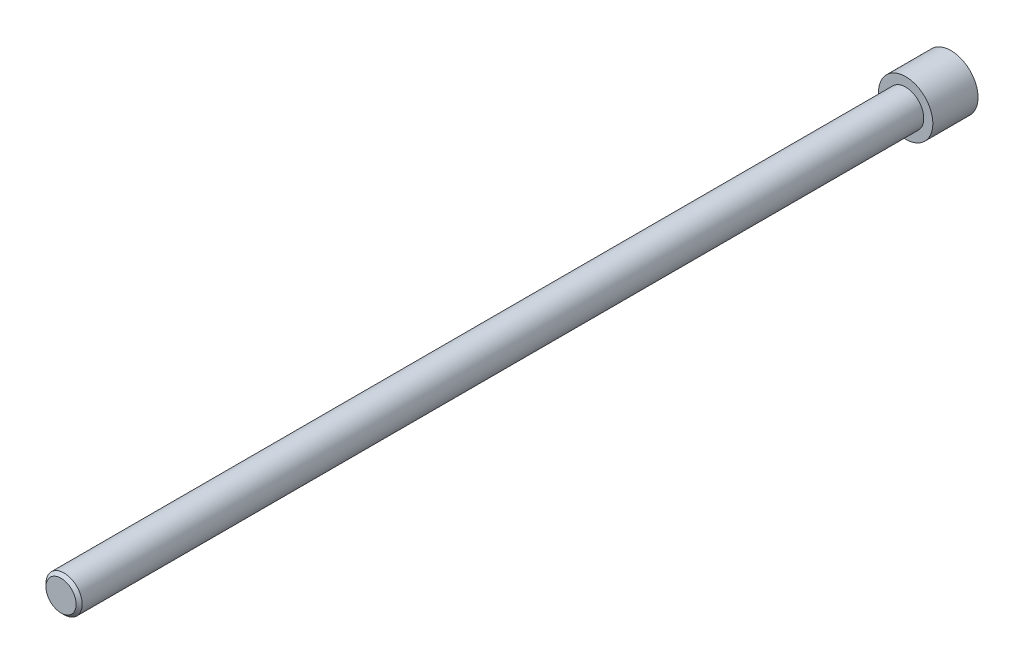
ISO-10303-21;
HEADER;
FILE_DESCRIPTION(('STEP AP214'),'2;1');
FILE_NAME('part.step','',(''),(''),'','','');
FILE_SCHEMA(('AUTOMOTIVE_DESIGN { 1 0 10303 214 1 1 1 1 }'));
ENDSEC;
DATA;
#1=APPLICATION_CONTEXT('core data for automotive mechanical design processes');
#2=APPLICATION_PROTOCOL_DEFINITION('international standard','automotive_design',2000,#1);
#3=PRODUCT_CONTEXT('',#1,'mechanical');
#4=PRODUCT('Part','Part','',(#3));
#5=PRODUCT_RELATED_PRODUCT_CATEGORY('part','',(#4));
#6=PRODUCT_DEFINITION_FORMATION('','',#4);
#7=PRODUCT_DEFINITION_CONTEXT('part definition',#1,'design');
#8=PRODUCT_DEFINITION('design','',#6,#7);
#9=PRODUCT_DEFINITION_SHAPE('','',#8);
#10=(LENGTH_UNIT() NAMED_UNIT(*) SI_UNIT(.MILLI.,.METRE.));
#11=(NAMED_UNIT(*) PLANE_ANGLE_UNIT() SI_UNIT($,.RADIAN.));
#12=(NAMED_UNIT(*) SI_UNIT($,.STERADIAN.) SOLID_ANGLE_UNIT());
#13=UNCERTAINTY_MEASURE_WITH_UNIT(LENGTH_MEASURE(1.E-05),#10,'distance_accuracy_value','');
#14=(GEOMETRIC_REPRESENTATION_CONTEXT(3) GLOBAL_UNCERTAINTY_ASSIGNED_CONTEXT((#13)) GLOBAL_UNIT_ASSIGNED_CONTEXT((#10,
#11,#12)) REPRESENTATION_CONTEXT('',''));
#15=CARTESIAN_POINT('',(0.,0.,0.));
#16=DIRECTION('',(0.,0.,1.));
#17=DIRECTION('',(1.,0.,0.));
#18=AXIS2_PLACEMENT_3D('',#15,#16,#17);
#19=CARTESIAN_POINT('',(0.,0.,140.));
#20=DIRECTION('',(0.,0.,-1.));
#21=DIRECTION('',(-1.,0.,0.));
#22=AXIS2_PLACEMENT_3D('',#19,#20,#21);
#23=CYLINDRICAL_SURFACE('',#22,3.);
#24=CARTESIAN_POINT('',(0.,0.,139.5));
#25=DIRECTION('',(0.,0.,1.));
#26=DIRECTION('',(1.,0.,0.));
#27=AXIS2_PLACEMENT_3D('',#24,#25,#26);
#28=CIRCLE('',#27,3.);
#29=CARTESIAN_POINT('',(3.,0.,139.5));
#30=VERTEX_POINT('',#29);
#31=EDGE_CURVE('E11',#30,#30,#28,.F.);
#32=ORIENTED_EDGE('',*,*,#31,.T.);
#33=EDGE_LOOP('',(#32));
#34=FACE_BOUND('',#33,.T.);
#35=CARTESIAN_POINT('',(0.,0.,0.));
#36=DIRECTION('',(0.,0.,1.));
#37=DIRECTION('',(1.,0.,0.));
#38=AXIS2_PLACEMENT_3D('',#35,#36,#37);
#39=CIRCLE('',#38,3.);
#40=CARTESIAN_POINT('',(3.,0.,0.));
#41=VERTEX_POINT('',#40);
#42=EDGE_CURVE('E144',#41,#41,#39,.T.);
#43=ORIENTED_EDGE('',*,*,#42,.T.);
#44=EDGE_LOOP('',(#43));
#45=FACE_BOUND('',#44,.T.);
#46=ADVANCED_FACE('F33',(#34,#45),#23,.T.);
#47=CARTESIAN_POINT('',(0.,0.,140.));
#48=DIRECTION('',(0.,0.,1.));
#49=DIRECTION('',(1.,0.,0.));
#50=AXIS2_PLACEMENT_3D('',#47,#48,#49);
#51=PLANE('',#50);
#52=CARTESIAN_POINT('',(0.,0.,140.));
#53=DIRECTION('',(0.,0.,1.));
#54=DIRECTION('',(1.,0.,0.));
#55=AXIS2_PLACEMENT_3D('',#52,#53,#54);
#56=CIRCLE('',#55,2.50000000000002);
#57=CARTESIAN_POINT('',(2.50000000000002,0.,140.));
#58=VERTEX_POINT('',#57);
#59=EDGE_CURVE('E41',#58,#58,#56,.T.);
#60=ORIENTED_EDGE('',*,*,#59,.T.);
#61=EDGE_LOOP('',(#60));
#62=FACE_BOUND('',#61,.T.);
#63=ADVANCED_FACE('F151',(#62),#51,.T.);
#64=CARTESIAN_POINT('',(0.,0.,-7.5));
#65=DIRECTION('',(0.,0.,1.));
#66=DIRECTION('',(1.,0.,0.));
#67=AXIS2_PLACEMENT_3D('',#64,#65,#66);
#68=CYLINDRICAL_SURFACE('',#67,4.5);
#69=CARTESIAN_POINT('',(0.,0.,-7.5));
#70=DIRECTION('',(0.,0.,-1.));
#71=DIRECTION('',(-1.,0.,0.));
#72=AXIS2_PLACEMENT_3D('',#69,#70,#71);
#73=CIRCLE('',#72,4.5);
#74=CARTESIAN_POINT('',(-4.5,0.,-7.5));
#75=VERTEX_POINT('',#74);
#76=EDGE_CURVE('E141',#75,#75,#73,.T.);
#77=ORIENTED_EDGE('',*,*,#76,.F.);
#78=EDGE_LOOP('',(#77));
#79=FACE_BOUND('',#78,.T.);
#80=CARTESIAN_POINT('',(0.,0.,0.));
#81=DIRECTION('',(0.,0.,-1.));
#82=DIRECTION('',(-1.,0.,0.));
#83=AXIS2_PLACEMENT_3D('',#80,#81,#82);
#84=CIRCLE('',#83,4.5);
#85=CARTESIAN_POINT('',(-4.5,0.,0.));
#86=VERTEX_POINT('',#85);
#87=EDGE_CURVE('E135',#86,#86,#84,.T.);
#88=ORIENTED_EDGE('',*,*,#87,.T.);
#89=EDGE_LOOP('',(#88));
#90=FACE_BOUND('',#89,.T.);
#91=ADVANCED_FACE('F166',(#79,#90),#68,.T.);
#92=CARTESIAN_POINT('',(0.,0.,-7.5));
#93=DIRECTION('',(0.,0.,-1.));
#94=DIRECTION('',(-1.,0.,0.));
#95=AXIS2_PLACEMENT_3D('',#92,#93,#94);
#96=PLANE('',#95);
#97=DIRECTION('',(-0.866025403784439,-0.5,0.));
#98=VECTOR('',#97,1.);
#99=CARTESIAN_POINT('',(2.4,-1.3856406460551,-7.5));
#100=LINE('',#99,#98);
#101=CARTESIAN_POINT('',(2.4,-1.3856406460551,-7.5));
#102=VERTEX_POINT('',#101);
#103=CARTESIAN_POINT('',(0.,-2.7712812921102,-7.5));
#104=VERTEX_POINT('',#103);
#105=EDGE_CURVE('E48',#102,#104,#100,.T.);
#106=ORIENTED_EDGE('',*,*,#105,.F.);
#107=DIRECTION('',(0.,-1.,0.));
#108=VECTOR('',#107,1.);
#109=CARTESIAN_POINT('',(2.4,1.3856406460551,-7.5));
#110=LINE('',#109,#108);
#111=CARTESIAN_POINT('',(2.4,1.3856406460551,-7.5));
#112=VERTEX_POINT('',#111);
#113=EDGE_CURVE('E131',#112,#102,#110,.T.);
#114=ORIENTED_EDGE('',*,*,#113,.F.);
#115=DIRECTION('',(0.866025403784439,-0.5,0.));
#116=VECTOR('',#115,1.);
#117=CARTESIAN_POINT('',(0.,2.7712812921102,-7.5));
#118=LINE('',#117,#116);
#119=CARTESIAN_POINT('',(0.,2.7712812921102,-7.5));
#120=VERTEX_POINT('',#119);
#121=EDGE_CURVE('E129',#120,#112,#118,.T.);
#122=ORIENTED_EDGE('',*,*,#121,.F.);
#123=DIRECTION('',(0.866025403784439,0.5,0.));
#124=VECTOR('',#123,1.);
#125=CARTESIAN_POINT('',(-2.4,1.3856406460551,-7.5));
#126=LINE('',#125,#124);
#127=CARTESIAN_POINT('',(-2.4,1.3856406460551,-7.5));
#128=VERTEX_POINT('',#127);
#129=EDGE_CURVE('E96',#128,#120,#126,.T.);
#130=ORIENTED_EDGE('',*,*,#129,.F.);
#131=DIRECTION('',(0.,1.,0.));
#132=VECTOR('',#131,1.);
#133=CARTESIAN_POINT('',(-2.4,-1.3856406460551,-7.5));
#134=LINE('',#133,#132);
#135=CARTESIAN_POINT('',(-2.4,-1.3856406460551,-7.5));
#136=VERTEX_POINT('',#135);
#137=EDGE_CURVE('E125',#136,#128,#134,.T.);
#138=ORIENTED_EDGE('',*,*,#137,.F.);
#139=DIRECTION('',(-0.866025403784439,0.5,0.));
#140=VECTOR('',#139,1.);
#141=CARTESIAN_POINT('',(0.,-2.7712812921102,-7.5));
#142=LINE('',#141,#140);
#143=EDGE_CURVE('E122',#104,#136,#142,.T.);
#144=ORIENTED_EDGE('',*,*,#143,.F.);
#145=EDGE_LOOP('',(#106,#114,#122,#130,#138,#144));
#146=FACE_BOUND('',#145,.T.);
#147=ORIENTED_EDGE('',*,*,#76,.T.);
#148=EDGE_LOOP('',(#147));
#149=FACE_BOUND('',#148,.T.);
#150=ADVANCED_FACE('F172',(#146,#149),#96,.T.);
#151=CARTESIAN_POINT('',(0.,0.,0.));
#152=DIRECTION('',(0.,0.,-1.));
#153=DIRECTION('',(-1.,0.,0.));
#154=AXIS2_PLACEMENT_3D('',#151,#152,#153);
#155=PLANE('',#154);
#156=ORIENTED_EDGE('',*,*,#42,.F.);
#157=EDGE_LOOP('',(#156));
#158=FACE_BOUND('',#157,.T.);
#159=ORIENTED_EDGE('',*,*,#87,.F.);
#160=EDGE_LOOP('',(#159));
#161=FACE_BOUND('',#160,.T.);
#162=ADVANCED_FACE('F174',(#158,#161),#155,.F.);
#163=CARTESIAN_POINT('',(2.4,-1.3856406460551,-3.));
#164=DIRECTION('',(0.5,-0.866025403784439,0.));
#165=DIRECTION('',(0.866025403784439,0.5,0.));
#166=AXIS2_PLACEMENT_3D('',#163,#164,#165);
#167=PLANE('',#166);
#168=ORIENTED_EDGE('',*,*,#105,.T.);
#169=DIRECTION('',(0.,0.,-1.));
#170=VECTOR('',#169,1.);
#171=CARTESIAN_POINT('',(0.,-2.7712812921102,-3.));
#172=LINE('',#171,#170);
#173=CARTESIAN_POINT('',(0.,-2.7712812921102,-3.));
#174=VERTEX_POINT('',#173);
#175=EDGE_CURVE('E78',#174,#104,#172,.T.);
#176=ORIENTED_EDGE('',*,*,#175,.F.);
#177=DIRECTION('',(-0.866025403784439,-0.5,0.));
#178=VECTOR('',#177,1.);
#179=CARTESIAN_POINT('',(2.4,-1.3856406460551,-3.));
#180=LINE('',#179,#178);
#181=CARTESIAN_POINT('',(2.4,-1.3856406460551,-3.));
#182=VERTEX_POINT('',#181);
#183=EDGE_CURVE('E133',#182,#174,#180,.T.);
#184=ORIENTED_EDGE('',*,*,#183,.F.);
#185=DIRECTION('',(0.,0.,-1.));
#186=VECTOR('',#185,1.);
#187=CARTESIAN_POINT('',(2.4,-1.3856406460551,-3.));
#188=LINE('',#187,#186);
#189=EDGE_CURVE('E56',#182,#102,#188,.T.);
#190=ORIENTED_EDGE('',*,*,#189,.T.);
#191=EDGE_LOOP('',(#168,#176,#184,#190));
#192=FACE_BOUND('',#191,.T.);
#193=ADVANCED_FACE('F177',(#192),#167,.F.);
#194=CARTESIAN_POINT('',(2.4,1.3856406460551,-3.));
#195=DIRECTION('',(1.,0.,0.));
#196=DIRECTION('',(0.,0.,-1.));
#197=AXIS2_PLACEMENT_3D('',#194,#195,#196);
#198=PLANE('',#197);
#199=ORIENTED_EDGE('',*,*,#113,.T.);
#200=ORIENTED_EDGE('',*,*,#189,.F.);
#201=DIRECTION('',(0.,-1.,0.));
#202=VECTOR('',#201,1.);
#203=CARTESIAN_POINT('',(2.4,1.3856406460551,-3.));
#204=LINE('',#203,#202);
#205=CARTESIAN_POINT('',(2.4,1.3856406460551,-3.));
#206=VERTEX_POINT('',#205);
#207=EDGE_CURVE('E108',#206,#182,#204,.T.);
#208=ORIENTED_EDGE('',*,*,#207,.F.);
#209=DIRECTION('',(0.,0.,-1.));
#210=VECTOR('',#209,1.);
#211=CARTESIAN_POINT('',(2.4,1.3856406460551,-3.));
#212=LINE('',#211,#210);
#213=EDGE_CURVE('E100',#206,#112,#212,.T.);
#214=ORIENTED_EDGE('',*,*,#213,.T.);
#215=EDGE_LOOP('',(#199,#200,#208,#214));
#216=FACE_BOUND('',#215,.T.);
#217=ADVANCED_FACE('F184',(#216),#198,.F.);
#218=CARTESIAN_POINT('',(0.,2.7712812921102,-3.));
#219=DIRECTION('',(0.5,0.866025403784439,0.));
#220=DIRECTION('',(-0.866025403784439,0.5,0.));
#221=AXIS2_PLACEMENT_3D('',#218,#219,#220);
#222=PLANE('',#221);
#223=ORIENTED_EDGE('',*,*,#121,.T.);
#224=ORIENTED_EDGE('',*,*,#213,.F.);
#225=DIRECTION('',(0.866025403784439,-0.5,0.));
#226=VECTOR('',#225,1.);
#227=CARTESIAN_POINT('',(0.,2.7712812921102,-3.));
#228=LINE('',#227,#226);
#229=CARTESIAN_POINT('',(0.,2.7712812921102,-3.));
#230=VERTEX_POINT('',#229);
#231=EDGE_CURVE('E104',#230,#206,#228,.T.);
#232=ORIENTED_EDGE('',*,*,#231,.F.);
#233=DIRECTION('',(0.,0.,-1.));
#234=VECTOR('',#233,1.);
#235=CARTESIAN_POINT('',(0.,2.7712812921102,-3.));
#236=LINE('',#235,#234);
#237=EDGE_CURVE('E89',#230,#120,#236,.T.);
#238=ORIENTED_EDGE('',*,*,#237,.T.);
#239=EDGE_LOOP('',(#223,#224,#232,#238));
#240=FACE_BOUND('',#239,.T.);
#241=ADVANCED_FACE('F105',(#240),#222,.F.);
#242=CARTESIAN_POINT('',(-2.4,1.3856406460551,-3.));
#243=DIRECTION('',(-0.5,0.866025403784439,0.));
#244=DIRECTION('',(-0.866025403784439,-0.5,0.));
#245=AXIS2_PLACEMENT_3D('',#242,#243,#244);
#246=PLANE('',#245);
#247=ORIENTED_EDGE('',*,*,#129,.T.);
#248=ORIENTED_EDGE('',*,*,#237,.F.);
#249=DIRECTION('',(0.866025403784439,0.5,0.));
#250=VECTOR('',#249,1.);
#251=CARTESIAN_POINT('',(-2.4,1.3856406460551,-3.));
#252=LINE('',#251,#250);
#253=CARTESIAN_POINT('',(-2.4,1.3856406460551,-3.));
#254=VERTEX_POINT('',#253);
#255=EDGE_CURVE('E93',#254,#230,#252,.T.);
#256=ORIENTED_EDGE('',*,*,#255,.F.);
#257=DIRECTION('',(0.,0.,-1.));
#258=VECTOR('',#257,1.);
#259=CARTESIAN_POINT('',(-2.4,1.3856406460551,-3.));
#260=LINE('',#259,#258);
#261=EDGE_CURVE('E101',#254,#128,#260,.T.);
#262=ORIENTED_EDGE('',*,*,#261,.T.);
#263=EDGE_LOOP('',(#247,#248,#256,#262));
#264=FACE_BOUND('',#263,.T.);
#265=ADVANCED_FACE('F91',(#264),#246,.F.);
#266=CARTESIAN_POINT('',(-2.4,-1.3856406460551,-3.));
#267=DIRECTION('',(-1.,0.,0.));
#268=DIRECTION('',(0.,-1.,0.));
#269=AXIS2_PLACEMENT_3D('',#266,#267,#268);
#270=PLANE('',#269);
#271=ORIENTED_EDGE('',*,*,#137,.T.);
#272=ORIENTED_EDGE('',*,*,#261,.F.);
#273=DIRECTION('',(0.,1.,0.));
#274=VECTOR('',#273,1.);
#275=CARTESIAN_POINT('',(-2.4,-1.3856406460551,-3.));
#276=LINE('',#275,#274);
#277=CARTESIAN_POINT('',(-2.4,-1.3856406460551,-3.));
#278=VERTEX_POINT('',#277);
#279=EDGE_CURVE('E114',#278,#254,#276,.T.);
#280=ORIENTED_EDGE('',*,*,#279,.F.);
#281=DIRECTION('',(0.,0.,-1.));
#282=VECTOR('',#281,1.);
#283=CARTESIAN_POINT('',(-2.4,-1.3856406460551,-3.));
#284=LINE('',#283,#282);
#285=EDGE_CURVE('E138',#278,#136,#284,.T.);
#286=ORIENTED_EDGE('',*,*,#285,.T.);
#287=EDGE_LOOP('',(#271,#272,#280,#286));
#288=FACE_BOUND('',#287,.T.);
#289=ADVANCED_FACE('F187',(#288),#270,.F.);
#290=CARTESIAN_POINT('',(0.,-2.7712812921102,-3.));
#291=DIRECTION('',(-0.5,-0.866025403784438,0.));
#292=DIRECTION('',(0.866025403784439,-0.5,0.));
#293=AXIS2_PLACEMENT_3D('',#290,#291,#292);
#294=PLANE('',#293);
#295=ORIENTED_EDGE('',*,*,#143,.T.);
#296=ORIENTED_EDGE('',*,*,#285,.F.);
#297=DIRECTION('',(-0.866025403784439,0.5,0.));
#298=VECTOR('',#297,1.);
#299=CARTESIAN_POINT('',(0.,-2.7712812921102,-3.));
#300=LINE('',#299,#298);
#301=EDGE_CURVE('E116',#174,#278,#300,.T.);
#302=ORIENTED_EDGE('',*,*,#301,.F.);
#303=ORIENTED_EDGE('',*,*,#175,.T.);
#304=EDGE_LOOP('',(#295,#296,#302,#303));
#305=FACE_BOUND('',#304,.T.);
#306=ADVANCED_FACE('F158',(#305),#294,.F.);
#307=CARTESIAN_POINT('',(0.,0.,-3.));
#308=DIRECTION('',(0.,0.,-1.));
#309=DIRECTION('',(-1.,0.,0.));
#310=AXIS2_PLACEMENT_3D('',#307,#308,#309);
#311=PLANE('',#310);
#312=ORIENTED_EDGE('',*,*,#183,.T.);
#313=ORIENTED_EDGE('',*,*,#301,.T.);
#314=ORIENTED_EDGE('',*,*,#279,.T.);
#315=ORIENTED_EDGE('',*,*,#255,.T.);
#316=ORIENTED_EDGE('',*,*,#231,.T.);
#317=ORIENTED_EDGE('',*,*,#207,.T.);
#318=EDGE_LOOP('',(#312,#313,#314,#315,#316,#317));
#319=FACE_BOUND('',#318,.T.);
#320=ADVANCED_FACE('F111',(#319),#311,.T.);
#321=CARTESIAN_POINT('',(0.,0.,140.));
#322=DIRECTION('',(0.,0.,-1.));
#323=DIRECTION('',(-1.,0.,0.));
#324=AXIS2_PLACEMENT_3D('',#321,#322,#323);
#325=CONICAL_SURFACE('',#324,2.50000000000002,0.78539816339746);
#326=ORIENTED_EDGE('',*,*,#31,.F.);
#327=EDGE_LOOP('',(#326));
#328=FACE_BOUND('',#327,.T.);
#329=ORIENTED_EDGE('',*,*,#59,.F.);
#330=EDGE_LOOP('',(#329));
#331=FACE_BOUND('',#330,.T.);
#332=ADVANCED_FACE('F35',(#328,#331),#325,.T.);
#333=CLOSED_SHELL('',(#46,#63,#91,#150,#162,#193,#217,#241,#265,#289,#306,#320,#332));
#334=MANIFOLD_SOLID_BREP('B2',#333);
#335=ADVANCED_BREP_SHAPE_REPRESENTATION('',(#18,#334),#14);
#336=SHAPE_DEFINITION_REPRESENTATION(#9,#335);
ENDSEC;
END-ISO-10303-21;
